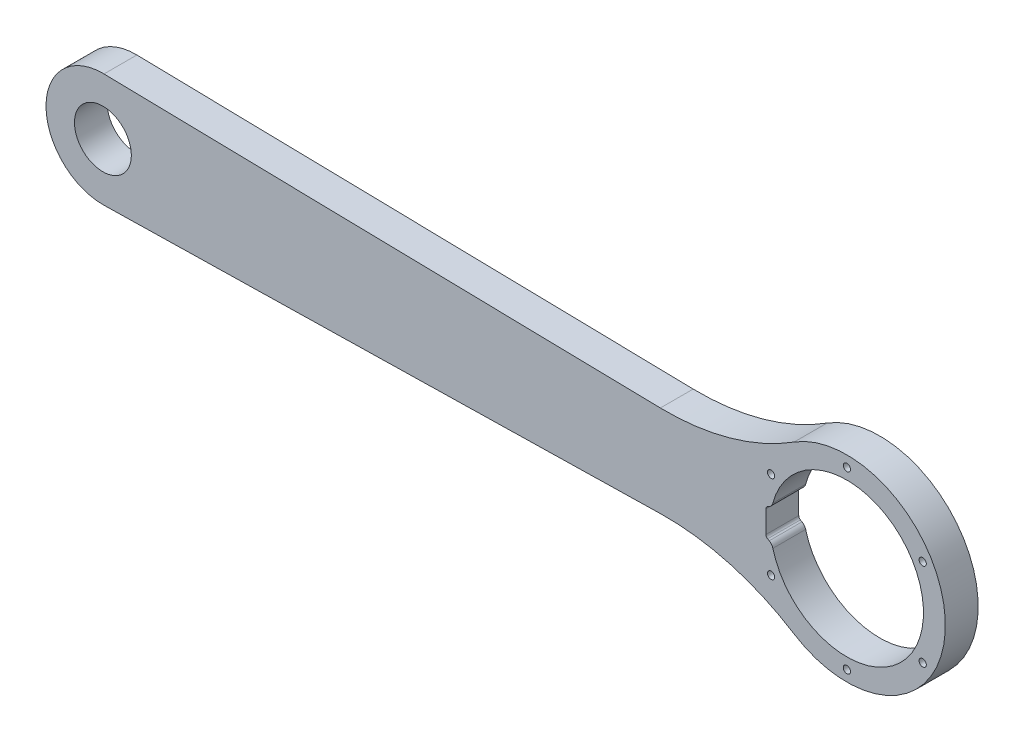
ISO-10303-21;
HEADER;
FILE_DESCRIPTION(('STEP AP214'),'2;1');
FILE_NAME('part.step','',(''),(''),'','','');
FILE_SCHEMA(('AUTOMOTIVE_DESIGN { 1 0 10303 214 1 1 1 1 }'));
ENDSEC;
DATA;
#1=APPLICATION_CONTEXT('core data for automotive mechanical design processes');
#2=APPLICATION_PROTOCOL_DEFINITION('international standard','automotive_design',2000,#1);
#3=PRODUCT_CONTEXT('',#1,'mechanical');
#4=PRODUCT('Part','Part','',(#3));
#5=PRODUCT_RELATED_PRODUCT_CATEGORY('part','',(#4));
#6=PRODUCT_DEFINITION_FORMATION('','',#4);
#7=PRODUCT_DEFINITION_CONTEXT('part definition',#1,'design');
#8=PRODUCT_DEFINITION('design','',#6,#7);
#9=PRODUCT_DEFINITION_SHAPE('','',#8);
#10=(LENGTH_UNIT() NAMED_UNIT(*) SI_UNIT(.MILLI.,.METRE.));
#11=(NAMED_UNIT(*) PLANE_ANGLE_UNIT() SI_UNIT($,.RADIAN.));
#12=(NAMED_UNIT(*) SI_UNIT($,.STERADIAN.) SOLID_ANGLE_UNIT());
#13=UNCERTAINTY_MEASURE_WITH_UNIT(LENGTH_MEASURE(1.E-05),#10,'distance_accuracy_value','');
#14=(GEOMETRIC_REPRESENTATION_CONTEXT(3) GLOBAL_UNCERTAINTY_ASSIGNED_CONTEXT((#13)) GLOBAL_UNIT_ASSIGNED_CONTEXT((#10,
#11,#12)) REPRESENTATION_CONTEXT('',''));
#15=CARTESIAN_POINT('',(0.,0.,0.));
#16=DIRECTION('',(0.,0.,1.));
#17=DIRECTION('',(1.,0.,0.));
#18=AXIS2_PLACEMENT_3D('',#15,#16,#17);
#19=CARTESIAN_POINT('',(-340.,0.,15.));
#20=DIRECTION('',(0.,0.,1.));
#21=DIRECTION('',(1.,0.,0.));
#22=AXIS2_PLACEMENT_3D('',#19,#20,#21);
#23=PLANE('',#22);
#24=CARTESIAN_POINT('',(-34.6410161513775,-20.,15.));
#25=DIRECTION('',(0.,0.,1.));
#26=DIRECTION('',(1.,0.,0.));
#27=AXIS2_PLACEMENT_3D('',#24,#25,#26);
#28=CIRCLE('',#27,1.64999999999994);
#29=CARTESIAN_POINT('',(-32.9910161513776,-20.,15.));
#30=VERTEX_POINT('',#29);
#31=EDGE_CURVE('E208',#30,#30,#28,.T.);
#32=ORIENTED_EDGE('',*,*,#31,.F.);
#33=EDGE_LOOP('',(#32));
#34=FACE_BOUND('',#33,.T.);
#35=CARTESIAN_POINT('',(4.21971692985525E-13,-40.,15.));
#36=DIRECTION('',(0.,0.,1.));
#37=DIRECTION('',(1.,0.,0.));
#38=AXIS2_PLACEMENT_3D('',#35,#36,#37);
#39=CIRCLE('',#38,1.65);
#40=CARTESIAN_POINT('',(1.65000000000042,-40.,15.));
#41=VERTEX_POINT('',#40);
#42=EDGE_CURVE('E220',#41,#41,#39,.T.);
#43=ORIENTED_EDGE('',*,*,#42,.F.);
#44=EDGE_LOOP('',(#43));
#45=FACE_BOUND('',#44,.T.);
#46=CARTESIAN_POINT('',(34.6410161513775,20.,15.));
#47=DIRECTION('',(0.,0.,1.));
#48=DIRECTION('',(1.,0.,0.));
#49=AXIS2_PLACEMENT_3D('',#46,#47,#48);
#50=CIRCLE('',#49,1.65);
#51=CARTESIAN_POINT('',(36.2910161513775,20.,15.));
#52=VERTEX_POINT('',#51);
#53=EDGE_CURVE('E232',#52,#52,#50,.T.);
#54=ORIENTED_EDGE('',*,*,#53,.F.);
#55=EDGE_LOOP('',(#54));
#56=FACE_BOUND('',#55,.T.);
#57=CARTESIAN_POINT('',(-340.,0.,15.));
#58=DIRECTION('',(0.,0.,1.));
#59=DIRECTION('',(1.,0.,0.));
#60=AXIS2_PLACEMENT_3D('',#57,#58,#59);
#61=CIRCLE('',#60,26.);
#62=CARTESIAN_POINT('',(-339.479111623952,25.9947816936342,15.));
#63=VERTEX_POINT('',#62);
#64=CARTESIAN_POINT('',(-339.479111623952,-25.9947816936342,15.));
#65=VERTEX_POINT('',#64);
#66=EDGE_CURVE('E244',#63,#65,#61,.T.);
#67=ORIENTED_EDGE('',*,*,#66,.T.);
#68=DIRECTION('',(0.999799295909007,0.0200341683095325,0.));
#69=VECTOR('',#68,1.);
#70=CARTESIAN_POINT('',(-85.2451135374465,-20.9003925212157,15.));
#71=LINE('',#70,#69);
#72=CARTESIAN_POINT('',(-85.2451135374465,-20.9003925212157,15.));
#73=VERTEX_POINT('',#72);
#74=EDGE_CURVE('E247',#65,#73,#71,.T.);
#75=ORIENTED_EDGE('',*,*,#74,.T.);
#76=CARTESIAN_POINT('',(-83.0413550233979,-130.878315071206,15.));
#77=DIRECTION('',(0.,0.,-1.));
#78=DIRECTION('',(-1.,0.,0.));
#79=AXIS2_PLACEMENT_3D('',#76,#77,#78);
#80=CIRCLE('',#79,110.);
#81=CARTESIAN_POINT('',(-24.1087804906639,-37.9969301819631,15.));
#82=VERTEX_POINT('',#81);
#83=EDGE_CURVE('E250',#73,#82,#80,.T.);
#84=ORIENTED_EDGE('',*,*,#83,.T.);
#85=CARTESIAN_POINT('',(0.,0.,15.));
#86=DIRECTION('',(0.,0.,1.));
#87=DIRECTION('',(-1.,0.,0.));
#88=AXIS2_PLACEMENT_3D('',#85,#86,#87);
#89=CIRCLE('',#88,45.);
#90=CARTESIAN_POINT('',(-24.1087804906639,37.9969301819632,15.));
#91=VERTEX_POINT('',#90);
#92=EDGE_CURVE('E252',#82,#91,#89,.T.);
#93=ORIENTED_EDGE('',*,*,#92,.T.);
#94=CARTESIAN_POINT('',(-83.0413550233979,130.878315071206,15.));
#95=DIRECTION('',(0.,0.,-1.));
#96=DIRECTION('',(-1.,0.,0.));
#97=AXIS2_PLACEMENT_3D('',#94,#95,#96);
#98=CIRCLE('',#97,110.);
#99=CARTESIAN_POINT('',(-85.2451135374464,20.9003925212157,15.));
#100=VERTEX_POINT('',#99);
#101=EDGE_CURVE('E254',#91,#100,#98,.T.);
#102=ORIENTED_EDGE('',*,*,#101,.T.);
#103=DIRECTION('',(-0.999799295909007,0.0200341683095325,0.));
#104=VECTOR('',#103,1.);
#105=CARTESIAN_POINT('',(-85.2451135374465,20.9003925212157,15.));
#106=LINE('',#105,#104);
#107=EDGE_CURVE('E256',#100,#63,#106,.T.);
#108=ORIENTED_EDGE('',*,*,#107,.T.);
#109=EDGE_LOOP('',(#67,#75,#84,#93,#102,#108));
#110=FACE_BOUND('',#109,.T.);
#111=CARTESIAN_POINT('',(-1.39107268084413E-13,40.,15.));
#112=DIRECTION('',(0.,0.,1.));
#113=DIRECTION('',(1.,0.,0.));
#114=AXIS2_PLACEMENT_3D('',#111,#112,#113);
#115=CIRCLE('',#114,1.65);
#116=CARTESIAN_POINT('',(1.64999999999986,40.,15.));
#117=VERTEX_POINT('',#116);
#118=EDGE_CURVE('E238',#117,#117,#115,.T.);
#119=ORIENTED_EDGE('',*,*,#118,.F.);
#120=EDGE_LOOP('',(#119));
#121=FACE_BOUND('',#120,.T.);
#122=CARTESIAN_POINT('',(34.6410161513778,-19.9999999999996,15.));
#123=DIRECTION('',(0.,0.,1.));
#124=DIRECTION('',(1.,0.,0.));
#125=AXIS2_PLACEMENT_3D('',#122,#123,#124);
#126=CIRCLE('',#125,1.65);
#127=CARTESIAN_POINT('',(36.2910161513778,-19.9999999999996,15.));
#128=VERTEX_POINT('',#127);
#129=EDGE_CURVE('E226',#128,#128,#126,.T.);
#130=ORIENTED_EDGE('',*,*,#129,.F.);
#131=EDGE_LOOP('',(#130));
#132=FACE_BOUND('',#131,.T.);
#133=CARTESIAN_POINT('',(-34.6410161513777,20.,15.));
#134=DIRECTION('',(0.,0.,1.));
#135=DIRECTION('',(1.,0.,0.));
#136=AXIS2_PLACEMENT_3D('',#133,#134,#135);
#137=CIRCLE('',#136,1.65);
#138=CARTESIAN_POINT('',(-32.9910161513777,20.,15.));
#139=VERTEX_POINT('',#138);
#140=EDGE_CURVE('E214',#139,#139,#137,.T.);
#141=ORIENTED_EDGE('',*,*,#140,.F.);
#142=EDGE_LOOP('',(#141));
#143=FACE_BOUND('',#142,.T.);
#144=CARTESIAN_POINT('',(-340.,0.,15.));
#145=DIRECTION('',(0.,0.,1.));
#146=DIRECTION('',(1.,0.,0.));
#147=AXIS2_PLACEMENT_3D('',#144,#145,#146);
#148=CIRCLE('',#147,13.);
#149=CARTESIAN_POINT('',(-327.,0.,15.));
#150=VERTEX_POINT('',#149);
#151=EDGE_CURVE('E202',#150,#150,#148,.T.);
#152=ORIENTED_EDGE('',*,*,#151,.F.);
#153=EDGE_LOOP('',(#152));
#154=FACE_BOUND('',#153,.T.);
#155=CARTESIAN_POINT('',(0.,0.,15.));
#156=DIRECTION('',(0.,0.,1.));
#157=DIRECTION('',(-1.,0.,0.));
#158=AXIS2_PLACEMENT_3D('',#155,#156,#157);
#159=CIRCLE('',#158,35.);
#160=CARTESIAN_POINT('',(-33.8381250940962,-8.94322593454391,15.));
#161=VERTEX_POINT('',#160);
#162=CARTESIAN_POINT('',(-33.8381250940962,8.94322593454391,15.));
#163=VERTEX_POINT('',#162);
#164=EDGE_CURVE('E145',#161,#163,#159,.T.);
#165=ORIENTED_EDGE('',*,*,#164,.F.);
#166=CARTESIAN_POINT('',(-37.2219376035058,-9.8375485279983,15.));
#167=DIRECTION('',(0.,0.,-1.));
#168=DIRECTION('',(-1.,0.,0.));
#169=AXIS2_PLACEMENT_3D('',#166,#167,#168);
#170=CIRCLE('',#169,3.50000000000001);
#171=CARTESIAN_POINT('',(-35.5000514131056,-6.79040101806232,15.));
#172=VERTEX_POINT('',#171);
#173=EDGE_CURVE('E137',#172,#161,#170,.T.);
#174=ORIENTED_EDGE('',*,*,#173,.F.);
#175=DIRECTION('',(0.870613574267424,-0.491967482971488,0.));
#176=VECTOR('',#175,1.);
#177=CARTESIAN_POINT('',(-35.5000514131056,-6.79040101806232,15.));
#178=LINE('',#177,#176);
#179=CARTESIAN_POINT('',(-36.2379512244573,-6.37342760574069,15.));
#180=VERTEX_POINT('',#179);
#181=EDGE_CURVE('E170',#180,#172,#178,.T.);
#182=ORIENTED_EDGE('',*,*,#181,.F.);
#183=CARTESIAN_POINT('',(-35.5,-5.06750724433956,15.));
#184=DIRECTION('',(0.,0.,1.));
#185=DIRECTION('',(-1.,0.,0.));
#186=AXIS2_PLACEMENT_3D('',#183,#184,#185);
#187=CIRCLE('',#186,1.5);
#188=CARTESIAN_POINT('',(-37.,-5.06750724433956,15.));
#189=VERTEX_POINT('',#188);
#190=EDGE_CURVE('E168',#189,#180,#187,.T.);
#191=ORIENTED_EDGE('',*,*,#190,.F.);
#192=DIRECTION('',(0.,-1.,0.));
#193=VECTOR('',#192,1.);
#194=CARTESIAN_POINT('',(-37.,5.06750724433955,15.));
#195=LINE('',#194,#193);
#196=CARTESIAN_POINT('',(-37.,5.06750724433955,15.));
#197=VERTEX_POINT('',#196);
#198=EDGE_CURVE('E166',#197,#189,#195,.T.);
#199=ORIENTED_EDGE('',*,*,#198,.F.);
#200=CARTESIAN_POINT('',(-35.5,5.06750724433956,15.));
#201=DIRECTION('',(0.,0.,1.));
#202=DIRECTION('',(1.,0.,0.));
#203=AXIS2_PLACEMENT_3D('',#200,#201,#202);
#204=CIRCLE('',#203,1.5);
#205=CARTESIAN_POINT('',(-36.2379512244572,6.3734276057407,15.));
#206=VERTEX_POINT('',#205);
#207=EDGE_CURVE('E164',#206,#197,#204,.T.);
#208=ORIENTED_EDGE('',*,*,#207,.F.);
#209=DIRECTION('',(-0.870613574267423,-0.491967482971489,0.));
#210=VECTOR('',#209,1.);
#211=CARTESIAN_POINT('',(-35.5000514131056,6.79040101806231,15.));
#212=LINE('',#211,#210);
#213=CARTESIAN_POINT('',(-35.5000514131056,6.79040101806231,15.));
#214=VERTEX_POINT('',#213);
#215=EDGE_CURVE('E160',#214,#206,#212,.T.);
#216=ORIENTED_EDGE('',*,*,#215,.F.);
#217=CARTESIAN_POINT('',(-37.2219376035058,9.8375485279983,15.));
#218=DIRECTION('',(0.,0.,-1.));
#219=DIRECTION('',(-1.,0.,0.));
#220=AXIS2_PLACEMENT_3D('',#217,#218,#219);
#221=CIRCLE('',#220,3.5);
#222=EDGE_CURVE('E158',#163,#214,#221,.T.);
#223=ORIENTED_EDGE('',*,*,#222,.F.);
#224=EDGE_LOOP('',(#165,#174,#182,#191,#199,#208,#216,#223));
#225=FACE_BOUND('',#224,.T.);
#226=ADVANCED_FACE('F36',(#34,#45,#56,#110,#121,#132,#143,#154,#225),#23,.T.);
#227=CARTESIAN_POINT('',(-340.,0.,0.));
#228=DIRECTION('',(0.,0.,1.));
#229=DIRECTION('',(1.,0.,0.));
#230=AXIS2_PLACEMENT_3D('',#227,#228,#229);
#231=PLANE('',#230);
#232=CARTESIAN_POINT('',(-340.,0.,0.));
#233=DIRECTION('',(0.,0.,1.));
#234=DIRECTION('',(1.,0.,0.));
#235=AXIS2_PLACEMENT_3D('',#232,#233,#234);
#236=CIRCLE('',#235,13.);
#237=CARTESIAN_POINT('',(-327.,0.,0.));
#238=VERTEX_POINT('',#237);
#239=EDGE_CURVE('E153',#238,#238,#236,.T.);
#240=ORIENTED_EDGE('',*,*,#239,.T.);
#241=EDGE_LOOP('',(#240));
#242=FACE_BOUND('',#241,.T.);
#243=CARTESIAN_POINT('',(-34.6410161513775,-20.,0.));
#244=DIRECTION('',(0.,0.,1.));
#245=DIRECTION('',(1.,0.,0.));
#246=AXIS2_PLACEMENT_3D('',#243,#244,#245);
#247=CIRCLE('',#246,1.64999999999994);
#248=CARTESIAN_POINT('',(-32.9910161513776,-20.,0.));
#249=VERTEX_POINT('',#248);
#250=EDGE_CURVE('E205',#249,#249,#247,.T.);
#251=ORIENTED_EDGE('',*,*,#250,.T.);
#252=EDGE_LOOP('',(#251));
#253=FACE_BOUND('',#252,.T.);
#254=CARTESIAN_POINT('',(-34.6410161513777,20.,0.));
#255=DIRECTION('',(0.,0.,1.));
#256=DIRECTION('',(1.,0.,0.));
#257=AXIS2_PLACEMENT_3D('',#254,#255,#256);
#258=CIRCLE('',#257,1.65);
#259=CARTESIAN_POINT('',(-32.9910161513777,20.,0.));
#260=VERTEX_POINT('',#259);
#261=EDGE_CURVE('E211',#260,#260,#258,.T.);
#262=ORIENTED_EDGE('',*,*,#261,.T.);
#263=EDGE_LOOP('',(#262));
#264=FACE_BOUND('',#263,.T.);
#265=CARTESIAN_POINT('',(4.21971692985525E-13,-40.,0.));
#266=DIRECTION('',(0.,0.,1.));
#267=DIRECTION('',(1.,0.,0.));
#268=AXIS2_PLACEMENT_3D('',#265,#266,#267);
#269=CIRCLE('',#268,1.65);
#270=CARTESIAN_POINT('',(1.65000000000042,-40.,0.));
#271=VERTEX_POINT('',#270);
#272=EDGE_CURVE('E217',#271,#271,#269,.T.);
#273=ORIENTED_EDGE('',*,*,#272,.T.);
#274=EDGE_LOOP('',(#273));
#275=FACE_BOUND('',#274,.T.);
#276=CARTESIAN_POINT('',(34.6410161513778,-19.9999999999996,0.));
#277=DIRECTION('',(0.,0.,1.));
#278=DIRECTION('',(1.,0.,0.));
#279=AXIS2_PLACEMENT_3D('',#276,#277,#278);
#280=CIRCLE('',#279,1.65);
#281=CARTESIAN_POINT('',(36.2910161513778,-19.9999999999996,0.));
#282=VERTEX_POINT('',#281);
#283=EDGE_CURVE('E223',#282,#282,#280,.T.);
#284=ORIENTED_EDGE('',*,*,#283,.T.);
#285=EDGE_LOOP('',(#284));
#286=FACE_BOUND('',#285,.T.);
#287=CARTESIAN_POINT('',(34.6410161513775,20.,0.));
#288=DIRECTION('',(0.,0.,1.));
#289=DIRECTION('',(1.,0.,0.));
#290=AXIS2_PLACEMENT_3D('',#287,#288,#289);
#291=CIRCLE('',#290,1.65);
#292=CARTESIAN_POINT('',(36.2910161513775,20.,0.));
#293=VERTEX_POINT('',#292);
#294=EDGE_CURVE('E229',#293,#293,#291,.T.);
#295=ORIENTED_EDGE('',*,*,#294,.T.);
#296=EDGE_LOOP('',(#295));
#297=FACE_BOUND('',#296,.T.);
#298=CARTESIAN_POINT('',(-1.39107268084413E-13,40.,0.));
#299=DIRECTION('',(0.,0.,1.));
#300=DIRECTION('',(1.,0.,0.));
#301=AXIS2_PLACEMENT_3D('',#298,#299,#300);
#302=CIRCLE('',#301,1.65);
#303=CARTESIAN_POINT('',(1.64999999999986,40.,0.));
#304=VERTEX_POINT('',#303);
#305=EDGE_CURVE('E235',#304,#304,#302,.T.);
#306=ORIENTED_EDGE('',*,*,#305,.T.);
#307=EDGE_LOOP('',(#306));
#308=FACE_BOUND('',#307,.T.);
#309=CARTESIAN_POINT('',(-340.,0.,0.));
#310=DIRECTION('',(0.,0.,1.));
#311=DIRECTION('',(1.,0.,0.));
#312=AXIS2_PLACEMENT_3D('',#309,#310,#311);
#313=CIRCLE('',#312,26.);
#314=CARTESIAN_POINT('',(-339.479111623952,25.9947816936342,0.));
#315=VERTEX_POINT('',#314);
#316=CARTESIAN_POINT('',(-339.479111623952,-25.9947816936342,0.));
#317=VERTEX_POINT('',#316);
#318=EDGE_CURVE('E241',#315,#317,#313,.T.);
#319=ORIENTED_EDGE('',*,*,#318,.F.);
#320=DIRECTION('',(-0.999799295909007,0.0200341683095325,0.));
#321=VECTOR('',#320,1.);
#322=CARTESIAN_POINT('',(-85.2451135374465,20.9003925212157,0.));
#323=LINE('',#322,#321);
#324=CARTESIAN_POINT('',(-85.2451135374464,20.9003925212157,0.));
#325=VERTEX_POINT('',#324);
#326=EDGE_CURVE('E248',#325,#315,#323,.T.);
#327=ORIENTED_EDGE('',*,*,#326,.F.);
#328=CARTESIAN_POINT('',(-83.0413550233979,130.878315071206,0.));
#329=DIRECTION('',(0.,0.,-1.));
#330=DIRECTION('',(-1.,0.,0.));
#331=AXIS2_PLACEMENT_3D('',#328,#329,#330);
#332=CIRCLE('',#331,110.);
#333=CARTESIAN_POINT('',(-24.1087804906639,37.9969301819632,0.));
#334=VERTEX_POINT('',#333);
#335=EDGE_CURVE('E267',#334,#325,#332,.T.);
#336=ORIENTED_EDGE('',*,*,#335,.F.);
#337=CARTESIAN_POINT('',(0.,0.,0.));
#338=DIRECTION('',(0.,0.,1.));
#339=DIRECTION('',(-1.,0.,0.));
#340=AXIS2_PLACEMENT_3D('',#337,#338,#339);
#341=CIRCLE('',#340,45.);
#342=CARTESIAN_POINT('',(-24.1087804906639,-37.9969301819631,0.));
#343=VERTEX_POINT('',#342);
#344=EDGE_CURVE('E265',#343,#334,#341,.T.);
#345=ORIENTED_EDGE('',*,*,#344,.F.);
#346=CARTESIAN_POINT('',(-83.0413550233979,-130.878315071206,0.));
#347=DIRECTION('',(0.,0.,-1.));
#348=DIRECTION('',(-1.,0.,0.));
#349=AXIS2_PLACEMENT_3D('',#346,#347,#348);
#350=CIRCLE('',#349,110.);
#351=CARTESIAN_POINT('',(-85.2451135374465,-20.9003925212157,0.));
#352=VERTEX_POINT('',#351);
#353=EDGE_CURVE('E263',#352,#343,#350,.T.);
#354=ORIENTED_EDGE('',*,*,#353,.F.);
#355=DIRECTION('',(0.999799295909007,0.0200341683095325,0.));
#356=VECTOR('',#355,1.);
#357=CARTESIAN_POINT('',(-85.2451135374465,-20.9003925212157,0.));
#358=LINE('',#357,#356);
#359=EDGE_CURVE('E261',#317,#352,#358,.T.);
#360=ORIENTED_EDGE('',*,*,#359,.F.);
#361=EDGE_LOOP('',(#319,#327,#336,#345,#354,#360));
#362=FACE_BOUND('',#361,.T.);
#363=CARTESIAN_POINT('',(-37.2219376035058,-9.8375485279983,0.));
#364=DIRECTION('',(0.,0.,-1.));
#365=DIRECTION('',(-1.,0.,0.));
#366=AXIS2_PLACEMENT_3D('',#363,#364,#365);
#367=CIRCLE('',#366,3.50000000000001);
#368=CARTESIAN_POINT('',(-35.5000514131056,-6.79040101806233,0.));
#369=VERTEX_POINT('',#368);
#370=CARTESIAN_POINT('',(-33.8381250940962,-8.94322593454391,0.));
#371=VERTEX_POINT('',#370);
#372=EDGE_CURVE('E59',#369,#371,#367,.T.);
#373=ORIENTED_EDGE('',*,*,#372,.T.);
#374=CARTESIAN_POINT('',(0.,0.,0.));
#375=DIRECTION('',(0.,0.,1.));
#376=DIRECTION('',(-1.,0.,0.));
#377=AXIS2_PLACEMENT_3D('',#374,#375,#376);
#378=CIRCLE('',#377,35.);
#379=CARTESIAN_POINT('',(-33.8381250940962,8.94322593454391,0.));
#380=VERTEX_POINT('',#379);
#381=EDGE_CURVE('E152',#371,#380,#378,.T.);
#382=ORIENTED_EDGE('',*,*,#381,.T.);
#383=CARTESIAN_POINT('',(-37.2219376035058,9.8375485279983,0.));
#384=DIRECTION('',(0.,0.,-1.));
#385=DIRECTION('',(-1.,0.,0.));
#386=AXIS2_PLACEMENT_3D('',#383,#384,#385);
#387=CIRCLE('',#386,3.5);
#388=CARTESIAN_POINT('',(-35.5000514131056,6.79040101806231,0.));
#389=VERTEX_POINT('',#388);
#390=EDGE_CURVE('E174',#380,#389,#387,.T.);
#391=ORIENTED_EDGE('',*,*,#390,.T.);
#392=DIRECTION('',(-0.870613574267423,-0.491967482971489,0.));
#393=VECTOR('',#392,1.);
#394=CARTESIAN_POINT('',(-35.5000514131056,6.79040101806231,0.));
#395=LINE('',#394,#393);
#396=CARTESIAN_POINT('',(-36.2379512244572,6.3734276057407,0.));
#397=VERTEX_POINT('',#396);
#398=EDGE_CURVE('E177',#389,#397,#395,.T.);
#399=ORIENTED_EDGE('',*,*,#398,.T.);
#400=CARTESIAN_POINT('',(-35.5,5.06750724433956,0.));
#401=DIRECTION('',(0.,0.,1.));
#402=DIRECTION('',(1.,0.,0.));
#403=AXIS2_PLACEMENT_3D('',#400,#401,#402);
#404=CIRCLE('',#403,1.5);
#405=CARTESIAN_POINT('',(-37.,5.06750724433955,0.));
#406=VERTEX_POINT('',#405);
#407=EDGE_CURVE('E180',#397,#406,#404,.T.);
#408=ORIENTED_EDGE('',*,*,#407,.T.);
#409=DIRECTION('',(0.,-1.,0.));
#410=VECTOR('',#409,1.);
#411=CARTESIAN_POINT('',(-37.,5.06750724433955,0.));
#412=LINE('',#411,#410);
#413=CARTESIAN_POINT('',(-37.,-5.06750724433956,0.));
#414=VERTEX_POINT('',#413);
#415=EDGE_CURVE('E183',#406,#414,#412,.T.);
#416=ORIENTED_EDGE('',*,*,#415,.T.);
#417=CARTESIAN_POINT('',(-35.5,-5.06750724433956,0.));
#418=DIRECTION('',(0.,0.,1.));
#419=DIRECTION('',(-1.,0.,0.));
#420=AXIS2_PLACEMENT_3D('',#417,#418,#419);
#421=CIRCLE('',#420,1.5);
#422=CARTESIAN_POINT('',(-36.2379512244572,-6.3734276057407,0.));
#423=VERTEX_POINT('',#422);
#424=EDGE_CURVE('E186',#414,#423,#421,.T.);
#425=ORIENTED_EDGE('',*,*,#424,.T.);
#426=DIRECTION('',(0.870613574267424,-0.491967482971488,0.));
#427=VECTOR('',#426,1.);
#428=CARTESIAN_POINT('',(-35.5000514131056,-6.79040101806232,0.));
#429=LINE('',#428,#427);
#430=EDGE_CURVE('E146',#423,#369,#429,.T.);
#431=ORIENTED_EDGE('',*,*,#430,.T.);
#432=EDGE_LOOP('',(#373,#382,#391,#399,#408,#416,#425,#431));
#433=FACE_BOUND('',#432,.T.);
#434=ADVANCED_FACE('F291',(#242,#253,#264,#275,#286,#297,#308,#362,#433),#231,.F.);
#435=CARTESIAN_POINT('',(-340.,0.,15.));
#436=DIRECTION('',(0.,0.,-1.));
#437=DIRECTION('',(-1.,0.,0.));
#438=AXIS2_PLACEMENT_3D('',#435,#436,#437);
#439=CYLINDRICAL_SURFACE('',#438,26.);
#440=ORIENTED_EDGE('',*,*,#318,.T.);
#441=DIRECTION('',(0.,0.,-1.));
#442=VECTOR('',#441,1.);
#443=CARTESIAN_POINT('',(-339.479111623952,-25.9947816936342,15.));
#444=LINE('',#443,#442);
#445=EDGE_CURVE('E11',#65,#317,#444,.T.);
#446=ORIENTED_EDGE('',*,*,#445,.F.);
#447=ORIENTED_EDGE('',*,*,#66,.F.);
#448=DIRECTION('',(0.,0.,-1.));
#449=VECTOR('',#448,1.);
#450=CARTESIAN_POINT('',(-339.479111623952,25.9947816936342,15.));
#451=LINE('',#450,#449);
#452=EDGE_CURVE('E258',#63,#315,#451,.T.);
#453=ORIENTED_EDGE('',*,*,#452,.T.);
#454=EDGE_LOOP('',(#440,#446,#447,#453));
#455=FACE_BOUND('',#454,.T.);
#456=ADVANCED_FACE('F38',(#455),#439,.T.);
#457=CARTESIAN_POINT('',(-85.2451135374465,-20.9003925212157,15.));
#458=DIRECTION('',(-0.0200341683095325,0.999799295909007,0.));
#459=DIRECTION('',(-0.999799295909007,-0.0200341683095325,0.));
#460=AXIS2_PLACEMENT_3D('',#457,#458,#459);
#461=PLANE('',#460);
#462=ORIENTED_EDGE('',*,*,#359,.T.);
#463=DIRECTION('',(0.,0.,-1.));
#464=VECTOR('',#463,1.);
#465=CARTESIAN_POINT('',(-85.2451135374465,-20.9003925212157,15.));
#466=LINE('',#465,#464);
#467=EDGE_CURVE('E44',#73,#352,#466,.T.);
#468=ORIENTED_EDGE('',*,*,#467,.F.);
#469=ORIENTED_EDGE('',*,*,#74,.F.);
#470=ORIENTED_EDGE('',*,*,#445,.T.);
#471=EDGE_LOOP('',(#462,#468,#469,#470));
#472=FACE_BOUND('',#471,.T.);
#473=ADVANCED_FACE('F309',(#472),#461,.F.);
#474=CARTESIAN_POINT('',(-83.0413550233979,-130.878315071206,15.));
#475=DIRECTION('',(0.,0.,-1.));
#476=DIRECTION('',(-1.,0.,0.));
#477=AXIS2_PLACEMENT_3D('',#474,#475,#476);
#478=CYLINDRICAL_SURFACE('',#477,110.);
#479=ORIENTED_EDGE('',*,*,#353,.T.);
#480=DIRECTION('',(0.,0.,-1.));
#481=VECTOR('',#480,1.);
#482=CARTESIAN_POINT('',(-24.1087804906639,-37.9969301819631,15.));
#483=LINE('',#482,#481);
#484=EDGE_CURVE('E278',#82,#343,#483,.T.);
#485=ORIENTED_EDGE('',*,*,#484,.F.);
#486=ORIENTED_EDGE('',*,*,#83,.F.);
#487=ORIENTED_EDGE('',*,*,#467,.T.);
#488=EDGE_LOOP('',(#479,#485,#486,#487));
#489=FACE_BOUND('',#488,.T.);
#490=ADVANCED_FACE('F285',(#489),#478,.F.);
#491=CARTESIAN_POINT('',(0.,0.,15.));
#492=DIRECTION('',(0.,0.,-1.));
#493=DIRECTION('',(-1.,0.,0.));
#494=AXIS2_PLACEMENT_3D('',#491,#492,#493);
#495=CYLINDRICAL_SURFACE('',#494,45.);
#496=ORIENTED_EDGE('',*,*,#344,.T.);
#497=DIRECTION('',(0.,0.,-1.));
#498=VECTOR('',#497,1.);
#499=CARTESIAN_POINT('',(-24.1087804906639,37.9969301819632,15.));
#500=LINE('',#499,#498);
#501=EDGE_CURVE('E275',#91,#334,#500,.T.);
#502=ORIENTED_EDGE('',*,*,#501,.F.);
#503=ORIENTED_EDGE('',*,*,#92,.F.);
#504=ORIENTED_EDGE('',*,*,#484,.T.);
#505=EDGE_LOOP('',(#496,#502,#503,#504));
#506=FACE_BOUND('',#505,.T.);
#507=ADVANCED_FACE('F297',(#506),#495,.T.);
#508=CARTESIAN_POINT('',(-83.0413550233979,130.878315071206,15.));
#509=DIRECTION('',(0.,0.,-1.));
#510=DIRECTION('',(-1.,0.,0.));
#511=AXIS2_PLACEMENT_3D('',#508,#509,#510);
#512=CYLINDRICAL_SURFACE('',#511,110.);
#513=ORIENTED_EDGE('',*,*,#335,.T.);
#514=DIRECTION('',(0.,0.,-1.));
#515=VECTOR('',#514,1.);
#516=CARTESIAN_POINT('',(-85.2451135374464,20.9003925212157,15.));
#517=LINE('',#516,#515);
#518=EDGE_CURVE('E272',#100,#325,#517,.T.);
#519=ORIENTED_EDGE('',*,*,#518,.F.);
#520=ORIENTED_EDGE('',*,*,#101,.F.);
#521=ORIENTED_EDGE('',*,*,#501,.T.);
#522=EDGE_LOOP('',(#513,#519,#520,#521));
#523=FACE_BOUND('',#522,.T.);
#524=ADVANCED_FACE('F301',(#523),#512,.F.);
#525=CARTESIAN_POINT('',(-85.2451135374465,20.9003925212157,15.));
#526=DIRECTION('',(-0.0200341683095325,-0.999799295909007,0.));
#527=DIRECTION('',(0.999799295909007,-0.0200341683095325,0.));
#528=AXIS2_PLACEMENT_3D('',#525,#526,#527);
#529=PLANE('',#528);
#530=ORIENTED_EDGE('',*,*,#326,.T.);
#531=ORIENTED_EDGE('',*,*,#452,.F.);
#532=ORIENTED_EDGE('',*,*,#107,.F.);
#533=ORIENTED_EDGE('',*,*,#518,.T.);
#534=EDGE_LOOP('',(#530,#531,#532,#533));
#535=FACE_BOUND('',#534,.T.);
#536=ADVANCED_FACE('F312',(#535),#529,.F.);
#537=CARTESIAN_POINT('',(-1.39107268084413E-13,40.,15.));
#538=DIRECTION('',(0.,0.,-1.));
#539=DIRECTION('',(-1.,0.,0.));
#540=AXIS2_PLACEMENT_3D('',#537,#538,#539);
#541=CYLINDRICAL_SURFACE('',#540,1.65);
#542=ORIENTED_EDGE('',*,*,#118,.T.);
#543=EDGE_LOOP('',(#542));
#544=FACE_BOUND('',#543,.T.);
#545=ORIENTED_EDGE('',*,*,#305,.F.);
#546=EDGE_LOOP('',(#545));
#547=FACE_BOUND('',#546,.T.);
#548=ADVANCED_FACE('F314',(#544,#547),#541,.F.);
#549=CARTESIAN_POINT('',(34.6410161513775,20.,15.));
#550=DIRECTION('',(0.,0.,-1.));
#551=DIRECTION('',(-1.,0.,0.));
#552=AXIS2_PLACEMENT_3D('',#549,#550,#551);
#553=CYLINDRICAL_SURFACE('',#552,1.65);
#554=ORIENTED_EDGE('',*,*,#53,.T.);
#555=EDGE_LOOP('',(#554));
#556=FACE_BOUND('',#555,.T.);
#557=ORIENTED_EDGE('',*,*,#294,.F.);
#558=EDGE_LOOP('',(#557));
#559=FACE_BOUND('',#558,.T.);
#560=ADVANCED_FACE('F320',(#556,#559),#553,.F.);
#561=CARTESIAN_POINT('',(34.6410161513778,-19.9999999999996,15.));
#562=DIRECTION('',(0.,0.,-1.));
#563=DIRECTION('',(-1.,0.,0.));
#564=AXIS2_PLACEMENT_3D('',#561,#562,#563);
#565=CYLINDRICAL_SURFACE('',#564,1.65);
#566=ORIENTED_EDGE('',*,*,#129,.T.);
#567=EDGE_LOOP('',(#566));
#568=FACE_BOUND('',#567,.T.);
#569=ORIENTED_EDGE('',*,*,#283,.F.);
#570=EDGE_LOOP('',(#569));
#571=FACE_BOUND('',#570,.T.);
#572=ADVANCED_FACE('F337',(#568,#571),#565,.F.);
#573=CARTESIAN_POINT('',(4.21971692985525E-13,-40.,15.));
#574=DIRECTION('',(0.,0.,-1.));
#575=DIRECTION('',(-1.,0.,0.));
#576=AXIS2_PLACEMENT_3D('',#573,#574,#575);
#577=CYLINDRICAL_SURFACE('',#576,1.65);
#578=ORIENTED_EDGE('',*,*,#42,.T.);
#579=EDGE_LOOP('',(#578));
#580=FACE_BOUND('',#579,.T.);
#581=ORIENTED_EDGE('',*,*,#272,.F.);
#582=EDGE_LOOP('',(#581));
#583=FACE_BOUND('',#582,.T.);
#584=ADVANCED_FACE('F341',(#580,#583),#577,.F.);
#585=CARTESIAN_POINT('',(-34.6410161513777,20.,15.));
#586=DIRECTION('',(0.,0.,-1.));
#587=DIRECTION('',(-1.,0.,0.));
#588=AXIS2_PLACEMENT_3D('',#585,#586,#587);
#589=CYLINDRICAL_SURFACE('',#588,1.65);
#590=ORIENTED_EDGE('',*,*,#140,.T.);
#591=EDGE_LOOP('',(#590));
#592=FACE_BOUND('',#591,.T.);
#593=ORIENTED_EDGE('',*,*,#261,.F.);
#594=EDGE_LOOP('',(#593));
#595=FACE_BOUND('',#594,.T.);
#596=ADVANCED_FACE('F345',(#592,#595),#589,.F.);
#597=CARTESIAN_POINT('',(-34.6410161513775,-20.,15.));
#598=DIRECTION('',(0.,0.,-1.));
#599=DIRECTION('',(-1.,0.,0.));
#600=AXIS2_PLACEMENT_3D('',#597,#598,#599);
#601=CYLINDRICAL_SURFACE('',#600,1.64999999999994);
#602=ORIENTED_EDGE('',*,*,#31,.T.);
#603=EDGE_LOOP('',(#602));
#604=FACE_BOUND('',#603,.T.);
#605=ORIENTED_EDGE('',*,*,#250,.F.);
#606=EDGE_LOOP('',(#605));
#607=FACE_BOUND('',#606,.T.);
#608=ADVANCED_FACE('F349',(#604,#607),#601,.F.);
#609=CARTESIAN_POINT('',(-340.,0.,15.));
#610=DIRECTION('',(0.,0.,-1.));
#611=DIRECTION('',(-1.,0.,0.));
#612=AXIS2_PLACEMENT_3D('',#609,#610,#611);
#613=CYLINDRICAL_SURFACE('',#612,13.);
#614=ORIENTED_EDGE('',*,*,#151,.T.);
#615=EDGE_LOOP('',(#614));
#616=FACE_BOUND('',#615,.T.);
#617=ORIENTED_EDGE('',*,*,#239,.F.);
#618=EDGE_LOOP('',(#617));
#619=FACE_BOUND('',#618,.T.);
#620=ADVANCED_FACE('F353',(#616,#619),#613,.F.);
#621=CARTESIAN_POINT('',(-37.2219376035058,-9.8375485279983,15.));
#622=DIRECTION('',(0.,0.,-1.));
#623=DIRECTION('',(-1.,0.,0.));
#624=AXIS2_PLACEMENT_3D('',#621,#622,#623);
#625=CYLINDRICAL_SURFACE('',#624,3.50000000000001);
#626=ORIENTED_EDGE('',*,*,#372,.F.);
#627=DIRECTION('',(0.,0.,-1.));
#628=VECTOR('',#627,1.);
#629=CARTESIAN_POINT('',(-35.5000514131056,-6.79040101806232,15.));
#630=LINE('',#629,#628);
#631=EDGE_CURVE('E141',#172,#369,#630,.T.);
#632=ORIENTED_EDGE('',*,*,#631,.F.);
#633=ORIENTED_EDGE('',*,*,#173,.T.);
#634=DIRECTION('',(0.,0.,-1.));
#635=VECTOR('',#634,1.);
#636=CARTESIAN_POINT('',(-33.8381250940962,-8.94322593454391,15.));
#637=LINE('',#636,#635);
#638=EDGE_CURVE('E140',#161,#371,#637,.T.);
#639=ORIENTED_EDGE('',*,*,#638,.T.);
#640=EDGE_LOOP('',(#626,#632,#633,#639));
#641=FACE_BOUND('',#640,.T.);
#642=ADVANCED_FACE('F139',(#641),#625,.T.);
#643=CARTESIAN_POINT('',(0.,0.,15.));
#644=DIRECTION('',(0.,0.,-1.));
#645=DIRECTION('',(-1.,0.,0.));
#646=AXIS2_PLACEMENT_3D('',#643,#644,#645);
#647=CYLINDRICAL_SURFACE('',#646,35.);
#648=ORIENTED_EDGE('',*,*,#381,.F.);
#649=ORIENTED_EDGE('',*,*,#638,.F.);
#650=ORIENTED_EDGE('',*,*,#164,.T.);
#651=DIRECTION('',(0.,0.,-1.));
#652=VECTOR('',#651,1.);
#653=CARTESIAN_POINT('',(-33.8381250940962,8.94322593454391,15.));
#654=LINE('',#653,#652);
#655=EDGE_CURVE('E154',#163,#380,#654,.T.);
#656=ORIENTED_EDGE('',*,*,#655,.T.);
#657=EDGE_LOOP('',(#648,#649,#650,#656));
#658=FACE_BOUND('',#657,.T.);
#659=ADVANCED_FACE('F149',(#658),#647,.F.);
#660=CARTESIAN_POINT('',(-37.2219376035058,9.8375485279983,15.));
#661=DIRECTION('',(0.,0.,-1.));
#662=DIRECTION('',(-1.,0.,0.));
#663=AXIS2_PLACEMENT_3D('',#660,#661,#662);
#664=CYLINDRICAL_SURFACE('',#663,3.5);
#665=ORIENTED_EDGE('',*,*,#390,.F.);
#666=ORIENTED_EDGE('',*,*,#655,.F.);
#667=ORIENTED_EDGE('',*,*,#222,.T.);
#668=DIRECTION('',(0.,0.,-1.));
#669=VECTOR('',#668,1.);
#670=CARTESIAN_POINT('',(-35.5000514131056,6.79040101806231,15.));
#671=LINE('',#670,#669);
#672=EDGE_CURVE('E199',#214,#389,#671,.T.);
#673=ORIENTED_EDGE('',*,*,#672,.T.);
#674=EDGE_LOOP('',(#665,#666,#667,#673));
#675=FACE_BOUND('',#674,.T.);
#676=ADVANCED_FACE('F362',(#675),#664,.T.);
#677=CARTESIAN_POINT('',(-35.5000514131056,6.79040101806231,15.));
#678=DIRECTION('',(0.491967482971489,-0.870613574267423,0.));
#679=DIRECTION('',(0.870613574267423,0.491967482971489,0.));
#680=AXIS2_PLACEMENT_3D('',#677,#678,#679);
#681=PLANE('',#680);
#682=ORIENTED_EDGE('',*,*,#398,.F.);
#683=ORIENTED_EDGE('',*,*,#672,.F.);
#684=ORIENTED_EDGE('',*,*,#215,.T.);
#685=DIRECTION('',(0.,0.,-1.));
#686=VECTOR('',#685,1.);
#687=CARTESIAN_POINT('',(-36.2379512244572,6.3734276057407,15.));
#688=LINE('',#687,#686);
#689=EDGE_CURVE('E197',#206,#397,#688,.T.);
#690=ORIENTED_EDGE('',*,*,#689,.T.);
#691=EDGE_LOOP('',(#682,#683,#684,#690));
#692=FACE_BOUND('',#691,.T.);
#693=ADVANCED_FACE('F365',(#692),#681,.T.);
#694=CARTESIAN_POINT('',(-35.5,5.06750724433956,15.));
#695=DIRECTION('',(0.,0.,-1.));
#696=DIRECTION('',(-1.,0.,0.));
#697=AXIS2_PLACEMENT_3D('',#694,#695,#696);
#698=CYLINDRICAL_SURFACE('',#697,1.5);
#699=ORIENTED_EDGE('',*,*,#407,.F.);
#700=ORIENTED_EDGE('',*,*,#689,.F.);
#701=ORIENTED_EDGE('',*,*,#207,.T.);
#702=DIRECTION('',(0.,0.,-1.));
#703=VECTOR('',#702,1.);
#704=CARTESIAN_POINT('',(-37.,5.06750724433955,15.));
#705=LINE('',#704,#703);
#706=EDGE_CURVE('E195',#197,#406,#705,.T.);
#707=ORIENTED_EDGE('',*,*,#706,.T.);
#708=EDGE_LOOP('',(#699,#700,#701,#707));
#709=FACE_BOUND('',#708,.T.);
#710=ADVANCED_FACE('F369',(#709),#698,.F.);
#711=CARTESIAN_POINT('',(-37.,5.06750724433955,15.));
#712=DIRECTION('',(1.,0.,0.));
#713=DIRECTION('',(0.,0.,-1.));
#714=AXIS2_PLACEMENT_3D('',#711,#712,#713);
#715=PLANE('',#714);
#716=ORIENTED_EDGE('',*,*,#415,.F.);
#717=ORIENTED_EDGE('',*,*,#706,.F.);
#718=ORIENTED_EDGE('',*,*,#198,.T.);
#719=DIRECTION('',(0.,0.,-1.));
#720=VECTOR('',#719,1.);
#721=CARTESIAN_POINT('',(-37.,-5.06750724433956,15.));
#722=LINE('',#721,#720);
#723=EDGE_CURVE('E193',#189,#414,#722,.T.);
#724=ORIENTED_EDGE('',*,*,#723,.T.);
#725=EDGE_LOOP('',(#716,#717,#718,#724));
#726=FACE_BOUND('',#725,.T.);
#727=ADVANCED_FACE('F373',(#726),#715,.T.);
#728=CARTESIAN_POINT('',(-35.5,-5.06750724433956,15.));
#729=DIRECTION('',(0.,0.,-1.));
#730=DIRECTION('',(-1.,0.,0.));
#731=AXIS2_PLACEMENT_3D('',#728,#729,#730);
#732=CYLINDRICAL_SURFACE('',#731,1.5);
#733=ORIENTED_EDGE('',*,*,#424,.F.);
#734=ORIENTED_EDGE('',*,*,#723,.F.);
#735=ORIENTED_EDGE('',*,*,#190,.T.);
#736=DIRECTION('',(0.,0.,-1.));
#737=VECTOR('',#736,1.);
#738=CARTESIAN_POINT('',(-36.2379512244572,-6.3734276057407,15.));
#739=LINE('',#738,#737);
#740=EDGE_CURVE('E51',#180,#423,#739,.T.);
#741=ORIENTED_EDGE('',*,*,#740,.T.);
#742=EDGE_LOOP('',(#733,#734,#735,#741));
#743=FACE_BOUND('',#742,.T.);
#744=ADVANCED_FACE('F377',(#743),#732,.F.);
#745=CARTESIAN_POINT('',(-35.5000514131056,-6.79040101806232,15.));
#746=DIRECTION('',(0.491967482971488,0.870613574267424,0.));
#747=DIRECTION('',(-0.870613574267424,0.491967482971488,0.));
#748=AXIS2_PLACEMENT_3D('',#745,#746,#747);
#749=PLANE('',#748);
#750=ORIENTED_EDGE('',*,*,#430,.F.);
#751=ORIENTED_EDGE('',*,*,#740,.F.);
#752=ORIENTED_EDGE('',*,*,#181,.T.);
#753=ORIENTED_EDGE('',*,*,#631,.T.);
#754=EDGE_LOOP('',(#750,#751,#752,#753));
#755=FACE_BOUND('',#754,.T.);
#756=ADVANCED_FACE('F381',(#755),#749,.T.);
#757=CLOSED_SHELL('',(#226,#434,#456,#473,#490,#507,#524,#536,#548,#560,#572,#584,#596,#608,
#620,#642,#659,#676,#693,#710,#727,#744,#756));
#758=MANIFOLD_SOLID_BREP('B2',#757);
#759=ADVANCED_BREP_SHAPE_REPRESENTATION('',(#18,#758),#14);
#760=SHAPE_DEFINITION_REPRESENTATION(#9,#759);
ENDSEC;
END-ISO-10303-21;
